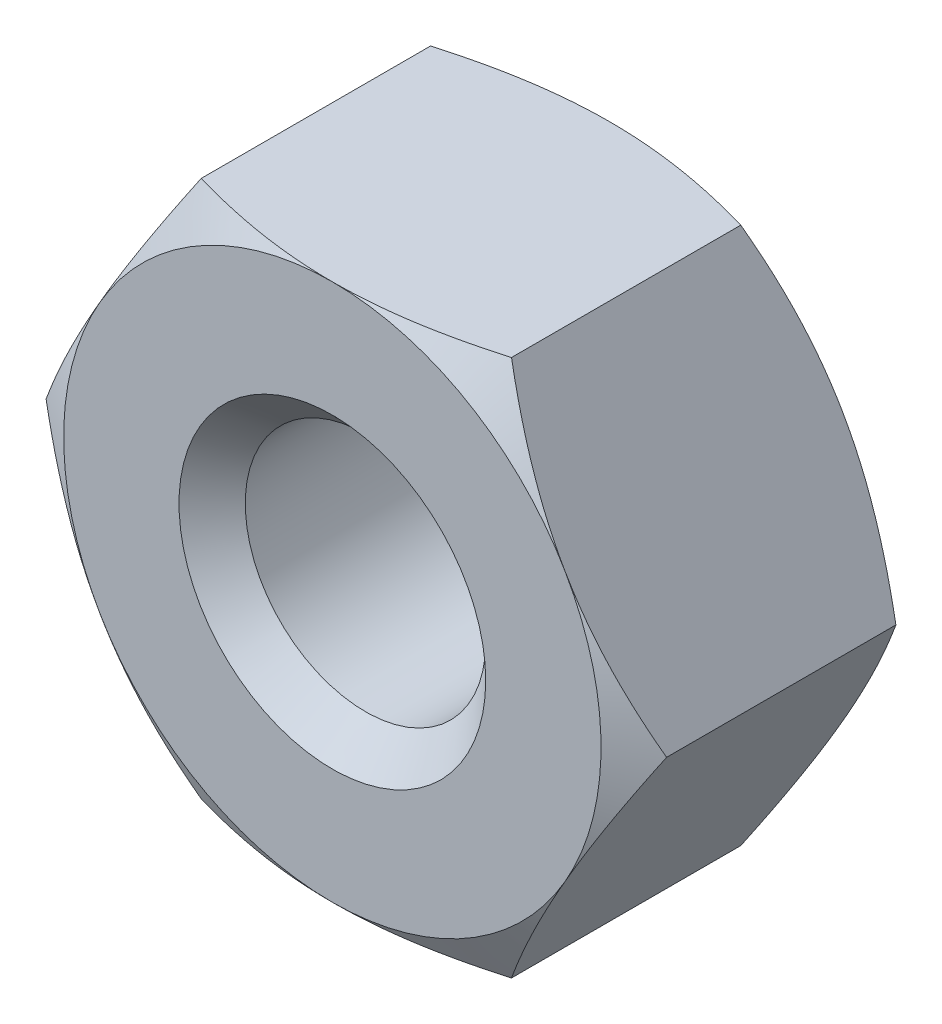
ISO-10303-21;
HEADER;
FILE_DESCRIPTION(('STEP AP214'),'2;1');
FILE_NAME('part.step','',(''),(''),'','','');
FILE_SCHEMA(('AUTOMOTIVE_DESIGN { 1 0 10303 214 1 1 1 1 }'));
ENDSEC;
DATA;
#1=APPLICATION_CONTEXT('core data for automotive mechanical design processes');
#2=APPLICATION_PROTOCOL_DEFINITION('international standard','automotive_design',2000,#1);
#3=PRODUCT_CONTEXT('',#1,'mechanical');
#4=PRODUCT('Part','Part','',(#3));
#5=PRODUCT_RELATED_PRODUCT_CATEGORY('part','',(#4));
#6=PRODUCT_DEFINITION_FORMATION('','',#4);
#7=PRODUCT_DEFINITION_CONTEXT('part definition',#1,'design');
#8=PRODUCT_DEFINITION('design','',#6,#7);
#9=PRODUCT_DEFINITION_SHAPE('','',#8);
#10=(LENGTH_UNIT() NAMED_UNIT(*) SI_UNIT(.MILLI.,.METRE.));
#11=(NAMED_UNIT(*) PLANE_ANGLE_UNIT() SI_UNIT($,.RADIAN.));
#12=(NAMED_UNIT(*) SI_UNIT($,.STERADIAN.) SOLID_ANGLE_UNIT());
#13=UNCERTAINTY_MEASURE_WITH_UNIT(LENGTH_MEASURE(1.E-05),#10,'distance_accuracy_value','');
#14=(GEOMETRIC_REPRESENTATION_CONTEXT(3) GLOBAL_UNCERTAINTY_ASSIGNED_CONTEXT((#13)) GLOBAL_UNIT_ASSIGNED_CONTEXT((#10,
#11,#12)) REPRESENTATION_CONTEXT('',''));
#15=CARTESIAN_POINT('',(0.,0.,0.));
#16=DIRECTION('',(0.,0.,1.));
#17=DIRECTION('',(1.,0.,0.));
#18=AXIS2_PLACEMENT_3D('',#15,#16,#17);
#19=CARTESIAN_POINT('',(0.,5.5626,2.8702));
#20=DIRECTION('',(0.,1.,0.));
#21=DIRECTION('',(0.,0.,1.));
#22=AXIS2_PLACEMENT_3D('',#19,#20,#21);
#23=PLANE('',#22);
#24=CARTESIAN_POINT('',(-8.51755323283637,5.5626,-0.208347349041716));
#25=CARTESIAN_POINT('',(-8.27332363806113,5.5626,-0.326372580376814));
#26=CARTESIAN_POINT('',(-8.02851660217952,5.5626,-0.443224542754662));
#27=CARTESIAN_POINT('',(-7.53743543039807,5.5626,-0.673911484447097));
#28=CARTESIAN_POINT('',(-7.29116104940888,5.5626,-0.787745941404617));
#29=CARTESIAN_POINT('',(-6.79550261529566,5.5626,-1.01232711326835));
#30=CARTESIAN_POINT('',(-6.54610883179355,5.5626,-1.1230524304109));
#31=CARTESIAN_POINT('',(-6.04527145316439,5.5626,-1.33974714026001));
#32=CARTESIAN_POINT('',(-5.79382796569385,5.5626,-1.44571678087108));
#33=CARTESIAN_POINT('',(-5.28536985938512,5.5626,-1.6528936222606));
#34=CARTESIAN_POINT('',(-5.02832474245623,5.5626,-1.75402638308214));
#35=CARTESIAN_POINT('',(-4.51120244313152,5.5626,-1.94837115353764));
#36=CARTESIAN_POINT('',(-4.25112492704733,5.5626,-2.04158228193144));
#37=CARTESIAN_POINT('',(-3.72805915600318,5.5626,-2.21757948920176));
#38=CARTESIAN_POINT('',(-3.46507843403137,5.5626,-2.30038773168016));
#39=CARTESIAN_POINT('',(-2.93537565240331,5.5626,-2.45288885972893));
#40=CARTESIAN_POINT('',(-2.66865480466814,5.5626,-2.52258589284272));
#41=CARTESIAN_POINT('',(-2.13130244368554,5.5626,-2.64548458392627));
#42=CARTESIAN_POINT('',(-1.86066990920863,5.5626,-2.69868184978898));
#43=CARTESIAN_POINT('',(-1.31610403640452,5.5626,-2.78498591226744));
#44=CARTESIAN_POINT('',(-1.04217069515921,5.5626,-2.81809269112068));
#45=CARTESIAN_POINT('',(-0.630834751400418,5.5626,-2.85056268521566));
#46=CARTESIAN_POINT('',(-0.494076025771256,5.5626,-2.85852263513214));
#47=CARTESIAN_POINT('',(-0.220337929367823,5.5626,-2.86864753142894));
#48=CARTESIAN_POINT('',(-0.0833585614820218,5.5626,-2.87081255306466));
#49=CARTESIAN_POINT('',(0.190527986234609,5.5626,-2.86928943521574));
#50=CARTESIAN_POINT('',(0.327435175535792,5.5626,-2.86560293840438));
#51=CARTESIAN_POINT('',(0.600975289543898,5.5626,-2.85247021161173));
#52=CARTESIAN_POINT('',(0.737608200212511,5.5626,-2.84302369399677));
#53=CARTESIAN_POINT('',(1.06876418963154,5.5626,-2.81334435018549));
#54=CARTESIAN_POINT('',(1.26303278569101,5.5626,-2.79022532002115));
#55=CARTESIAN_POINT('',(1.65008136813439,5.5626,-2.73362542907433));
#56=CARTESIAN_POINT('',(1.84286093346577,5.5626,-2.70014174004453));
#57=CARTESIAN_POINT('',(2.22677234634108,5.5626,-2.62400003398817));
#58=CARTESIAN_POINT('',(2.41790245700259,5.5626,-2.58133334257669));
#59=CARTESIAN_POINT('',(2.79819622482317,5.5626,-2.48812745826837));
#60=CARTESIAN_POINT('',(2.98736006544266,5.5626,-2.437589006999));
#61=CARTESIAN_POINT('',(3.36838035193452,5.5626,-2.32852760486082));
#62=CARTESIAN_POINT('',(3.56018914103518,5.5626,-2.26983930247945));
#63=CARTESIAN_POINT('',(3.94177929576716,5.5626,-2.14666395442924));
#64=CARTESIAN_POINT('',(4.13156196016662,5.5626,-2.08218090838606));
#65=CARTESIAN_POINT('',(4.50833833653704,5.5626,-1.94874803332032));
#66=CARTESIAN_POINT('',(4.69534173392172,5.5626,-1.87982538930164));
#67=CARTESIAN_POINT('',(5.06789764166536,5.5626,-1.73793473455086));
#68=CARTESIAN_POINT('',(5.2534495305557,5.5626,-1.66496508881955));
#69=CARTESIAN_POINT('',(5.43832732995836,5.5626,-1.59037228005264));
#70=B_SPLINE_CURVE_WITH_KNOTS('',3,(#24,#25,#26,#27,#28,#29,#30,#31,#32,#33,#34,#35,#36,#37,#38,
#39,#40,#41,#42,#43,#44,#45,#46,#47,#48,#49,#50,#51,#52,#53,#54,#55,#56,#57,#58,#59,#60,#61,#62,
#63,#64,#65,#66,#67,#68,#69),.UNSPECIFIED.,.F.,.F.,(4,2,2,2,2,2,2,2,2,2,2,2,2,2,2,2,2,2,2,2,2,2,
4),(0.,0.813769153285017,1.62767826928287,2.44624505844444,3.26476912757194,4.09334213197154,
4.92200719045545,5.74887568591705,6.57548217189049,7.40230850547898,8.22913557008481,
8.64000180756481,9.05086270933452,9.46160829216968,9.87237438776677,10.4589658361105,
11.0457174914015,11.633025851848,12.2202789132433,12.8219268163372,13.4231625958885,
14.021014216553,14.6191091556216),.UNSPECIFIED.);
#71=CARTESIAN_POINT('',(-3.21156860739421,5.5626,-2.37336860739422));
#72=VERTEX_POINT('',#71);
#73=CARTESIAN_POINT('',(0.,5.5626,-2.8702));
#74=VERTEX_POINT('',#73);
#75=EDGE_CURVE('E464',#72,#74,#70,.T.);
#76=ORIENTED_EDGE('',*,*,#75,.F.);
#77=DIRECTION('',(0.,0.,-1.));
#78=VECTOR('',#77,1.);
#79=CARTESIAN_POINT('',(-3.21156860739422,5.5626,2.8702));
#80=LINE('',#79,#78);
#81=CARTESIAN_POINT('',(-3.21156860739421,5.5626,2.37336860739422));
#82=VERTEX_POINT('',#81);
#83=EDGE_CURVE('E146',#82,#72,#80,.T.);
#84=ORIENTED_EDGE('',*,*,#83,.F.);
#85=CARTESIAN_POINT('',(-8.51755323283637,5.5626,0.208347349041714));
#86=CARTESIAN_POINT('',(-8.27332363806113,5.5626,0.326372580376813));
#87=CARTESIAN_POINT('',(-8.02851660217952,5.5626,0.443224542754661));
#88=CARTESIAN_POINT('',(-7.53743543039807,5.5626,0.673911484447096));
#89=CARTESIAN_POINT('',(-7.29116104940888,5.5626,0.787745941404615));
#90=CARTESIAN_POINT('',(-6.79550261529566,5.5626,1.01232711326835));
#91=CARTESIAN_POINT('',(-6.54610883179356,5.5626,1.1230524304109));
#92=CARTESIAN_POINT('',(-6.0452714531644,5.5626,1.33974714026001));
#93=CARTESIAN_POINT('',(-5.79382796569386,5.5626,1.44571678087108));
#94=CARTESIAN_POINT('',(-5.28536985938512,5.5626,1.6528936222606));
#95=CARTESIAN_POINT('',(-5.02832474245624,5.5626,1.75402638308214));
#96=CARTESIAN_POINT('',(-4.51120244313152,5.5626,1.94837115353763));
#97=CARTESIAN_POINT('',(-4.25112492704734,5.5626,2.04158228193144));
#98=CARTESIAN_POINT('',(-3.72805915600318,5.5626,2.21757948920176));
#99=CARTESIAN_POINT('',(-3.46507843403138,5.5626,2.30038773168015));
#100=CARTESIAN_POINT('',(-2.93537565240331,5.5626,2.45288885972893));
#101=CARTESIAN_POINT('',(-2.66865480466815,5.5626,2.52258589284272));
#102=CARTESIAN_POINT('',(-2.13130244368554,5.5626,2.64548458392627));
#103=CARTESIAN_POINT('',(-1.86066990920863,5.5626,2.69868184978897));
#104=CARTESIAN_POINT('',(-1.31610403640452,5.5626,2.78498591226744));
#105=CARTESIAN_POINT('',(-1.04217069515921,5.5626,2.81809269112068));
#106=CARTESIAN_POINT('',(-0.63083475140042,5.5626,2.85056268521566));
#107=CARTESIAN_POINT('',(-0.494076025771258,5.5626,2.85852263513214));
#108=CARTESIAN_POINT('',(-0.220337929367824,5.5626,2.86864753142893));
#109=CARTESIAN_POINT('',(-0.0833585614820228,5.5626,2.87081255306466));
#110=CARTESIAN_POINT('',(0.190527986234609,5.5626,2.86928943521574));
#111=CARTESIAN_POINT('',(0.327435175535791,5.5626,2.86560293840438));
#112=CARTESIAN_POINT('',(0.600975289543897,5.5626,2.85247021161173));
#113=CARTESIAN_POINT('',(0.73760820021251,5.5626,2.84302369399677));
#114=CARTESIAN_POINT('',(1.06876418963153,5.5626,2.81334435018549));
#115=CARTESIAN_POINT('',(1.263032785691,5.5626,2.79022532002115));
#116=CARTESIAN_POINT('',(1.65008136813439,5.5626,2.73362542907433));
#117=CARTESIAN_POINT('',(1.84286093346577,5.5626,2.70014174004453));
#118=CARTESIAN_POINT('',(2.22677234634107,5.5626,2.62400003398817));
#119=CARTESIAN_POINT('',(2.41790245700259,5.5626,2.58133334257669));
#120=CARTESIAN_POINT('',(2.79819622482316,5.5626,2.48812745826837));
#121=CARTESIAN_POINT('',(2.98736006544265,5.5626,2.43758900699901));
#122=CARTESIAN_POINT('',(3.36838035193452,5.5626,2.32852760486083));
#123=CARTESIAN_POINT('',(3.56018914103517,5.5626,2.26983930247945));
#124=CARTESIAN_POINT('',(3.94177929576715,5.5626,2.14666395442924));
#125=CARTESIAN_POINT('',(4.13156196016661,5.5626,2.08218090838606));
#126=CARTESIAN_POINT('',(4.50833833653703,5.5626,1.94874803332033));
#127=CARTESIAN_POINT('',(4.69534173392171,5.5626,1.87982538930164));
#128=CARTESIAN_POINT('',(5.06789764166535,5.5626,1.73793473455086));
#129=CARTESIAN_POINT('',(5.25344953055569,5.5626,1.66496508881956));
#130=CARTESIAN_POINT('',(5.43832732995835,5.5626,1.59037228005265));
#131=B_SPLINE_CURVE_WITH_KNOTS('',3,(#85,#86,#87,#88,#89,#90,#91,#92,#93,#94,#95,#96,#97,#98,
#99,#100,#101,#102,#103,#104,#105,#106,#107,#108,#109,#110,#111,#112,#113,#114,#115,#116,#117,
#118,#119,#120,#121,#122,#123,#124,#125,#126,#127,#128,#129,#130),.UNSPECIFIED.,.F.,.F.,(4,2,2,
2,2,2,2,2,2,2,2,2,2,2,2,2,2,2,2,2,2,2,4),(0.,0.813769153285015,1.62767826928287,
2.44624505844444,3.26476912757194,4.09334213197154,4.92200719045544,5.74887568591705,
6.57548217189049,7.40230850547898,8.22913557008481,8.64000180756481,9.05086270933452,
9.46160829216968,9.87237438776677,10.4589658361105,11.0457174914015,11.633025851848,
12.2202789132433,12.8219268163372,13.4231625958885,14.021014216553,14.6191091556215),.UNSPECIFIED.);
#132=CARTESIAN_POINT('',(0.,5.5626,2.8702));
#133=VERTEX_POINT('',#132);
#134=EDGE_CURVE('E277',#82,#133,#131,.T.);
#135=ORIENTED_EDGE('',*,*,#134,.T.);
#136=CARTESIAN_POINT('',(3.21156860739421,5.5626,2.37336860739422));
#137=VERTEX_POINT('',#136);
#138=EDGE_CURVE('E194',#133,#137,#131,.T.);
#139=ORIENTED_EDGE('',*,*,#138,.T.);
#140=DIRECTION('',(0.,0.,-1.));
#141=VECTOR('',#140,1.);
#142=CARTESIAN_POINT('',(3.21156860739421,5.5626,2.8702));
#143=LINE('',#142,#141);
#144=CARTESIAN_POINT('',(3.21156860739421,5.5626,-2.37336860739422));
#145=VERTEX_POINT('',#144);
#146=EDGE_CURVE('E132',#137,#145,#143,.T.);
#147=ORIENTED_EDGE('',*,*,#146,.T.);
#148=EDGE_CURVE('E125',#74,#145,#70,.T.);
#149=ORIENTED_EDGE('',*,*,#148,.F.);
#150=EDGE_LOOP('',(#76,#84,#135,#139,#147,#149));
#151=FACE_BOUND('',#150,.T.);
#152=ADVANCED_FACE('F17',(#151),#23,.T.);
#153=CARTESIAN_POINT('',(-4.81735291109132,2.7813,2.8702));
#154=DIRECTION('',(-0.866025403784439,0.5,0.));
#155=DIRECTION('',(-0.5,-0.866025403784439,0.));
#156=AXIS2_PLACEMENT_3D('',#153,#154,#155);
#157=PLANE('',#156);
#158=CARTESIAN_POINT('',(-6.42325268484226,-0.00020000000000477,-2.37330193892986));
#159=CARTESIAN_POINT('',(-6.35265858120791,0.122072574209488,-2.41405379774487));
#160=CARTESIAN_POINT('',(-6.28180126837449,0.244801040124761,-2.45295622469128));
#161=CARTESIAN_POINT('',(-6.13951120287093,0.491254662989242,-2.52655283843946));
#162=CARTESIAN_POINT('',(-6.06807821602765,0.614980225538196,-2.56124520986096));
#163=CARTESIAN_POINT('',(-5.85263550648139,0.988137944592619,-2.65832629893315));
#164=CARTESIAN_POINT('',(-5.70777535201369,1.23904309212296,-2.71354515807663));
#165=CARTESIAN_POINT('',(-5.49099476252075,1.61451808721945,-2.77829621381847));
#166=CARTESIAN_POINT('',(-5.41972205873199,1.73796603137439,-2.79674200165707));
#167=CARTESIAN_POINT('',(-5.27685459691414,1.98541973399132,-2.82767310833254));
#168=CARTESIAN_POINT('',(-5.20525986790488,2.10942544218948,-2.84015895381099));
#169=CARTESIAN_POINT('',(-5.06194605565757,2.35765224642821,-2.85885197006053));
#170=CARTESIAN_POINT('',(-4.9902272065059,2.48187293701927,-2.86506626659415));
#171=CARTESIAN_POINT('',(-4.84672720555795,2.7304222295473,-2.8710895993591));
#172=CARTESIAN_POINT('',(-4.7749460557547,2.85475082803225,-2.8708988334483));
#173=CARTESIAN_POINT('',(-4.57828637012705,3.19537539533984,-2.86157189863658));
#174=CARTESIAN_POINT('',(-4.4534722013835,3.41155987710816,-2.84591260446492));
#175=CARTESIAN_POINT('',(-4.20467287416474,3.84249295274001,-2.79625567661839));
#176=CARTESIAN_POINT('',(-4.08068859075412,4.05724003094723,-2.76224106857654));
#177=CARTESIAN_POINT('',(-3.83138850679899,4.4890404426887,-2.67721395859032));
#178=CARTESIAN_POINT('',(-3.70610416511177,4.70603928788379,-2.6258411860626));
#179=CARTESIAN_POINT('',(-3.45740388365366,5.13680081122591,-2.5092455430004));
#180=CARTESIAN_POINT('',(-3.33398475856357,5.35056900650764,-2.44405006238294));
#181=CARTESIAN_POINT('',(-3.21145313734037,5.5628,-2.37330193892986));
#182=B_SPLINE_CURVE_WITH_KNOTS('',3,(#158,#159,#160,#161,#162,#163,#164,#165,#166,#167,#168,
#169,#170,#171,#172,#173,#174,#175,#176,#177,#178,#179,#180,#181),.UNSPECIFIED.,.F.,.F.,(4,2,2,
2,2,2,2,2,2,2,2,4),(0.,0.44082011856227,0.881829648847399,1.76568130465016,2.19678242164486,
2.62784543796583,3.05841812523868,3.48897751176352,4.23854798324166,4.98881282275669,
5.75571809391027,6.52111769989992),.UNSPECIFIED.);
#183=CARTESIAN_POINT('',(-6.42313721478843,0.,-2.37336860739422));
#184=VERTEX_POINT('',#183);
#185=CARTESIAN_POINT('',(-4.81735291109132,2.7813,-2.8702));
#186=VERTEX_POINT('',#185);
#187=EDGE_CURVE('E238',#184,#186,#182,.T.);
#188=ORIENTED_EDGE('',*,*,#187,.F.);
#189=DIRECTION('',(0.,0.,-1.));
#190=VECTOR('',#189,1.);
#191=CARTESIAN_POINT('',(-6.42313721478842,0.,2.8702));
#192=LINE('',#191,#190);
#193=CARTESIAN_POINT('',(-6.42313721478843,0.,2.37336860739422));
#194=VERTEX_POINT('',#193);
#195=EDGE_CURVE('E143',#194,#184,#192,.T.);
#196=ORIENTED_EDGE('',*,*,#195,.F.);
#197=CARTESIAN_POINT('',(-6.42325268484226,-0.00020000000000477,2.37330193892986));
#198=CARTESIAN_POINT('',(-6.35265858120791,0.122072574209488,2.41405379774487));
#199=CARTESIAN_POINT('',(-6.28180126837449,0.244801040124761,2.45295622469128));
#200=CARTESIAN_POINT('',(-6.13951120287093,0.491254662989242,2.52655283843946));
#201=CARTESIAN_POINT('',(-6.06807821602765,0.614980225538196,2.56124520986096));
#202=CARTESIAN_POINT('',(-5.85263550648139,0.988137944592619,2.65832629893315));
#203=CARTESIAN_POINT('',(-5.70777535201369,1.23904309212296,2.71354515807663));
#204=CARTESIAN_POINT('',(-5.49099476252075,1.61451808721945,2.77829621381847));
#205=CARTESIAN_POINT('',(-5.41972205873199,1.73796603137439,2.79674200165707));
#206=CARTESIAN_POINT('',(-5.27685459691414,1.98541973399132,2.82767310833254));
#207=CARTESIAN_POINT('',(-5.20525986790488,2.10942544218948,2.84015895381099));
#208=CARTESIAN_POINT('',(-5.06194605565757,2.35765224642821,2.85885197006053));
#209=CARTESIAN_POINT('',(-4.9902272065059,2.48187293701927,2.86506626659415));
#210=CARTESIAN_POINT('',(-4.84672720555795,2.7304222295473,2.8710895993591));
#211=CARTESIAN_POINT('',(-4.7749460557547,2.85475082803225,2.8708988334483));
#212=CARTESIAN_POINT('',(-4.57828637012705,3.19537539533984,2.86157189863658));
#213=CARTESIAN_POINT('',(-4.4534722013835,3.41155987710816,2.84591260446492));
#214=CARTESIAN_POINT('',(-4.20467287416474,3.84249295274001,2.79625567661839));
#215=CARTESIAN_POINT('',(-4.08068859075412,4.05724003094723,2.76224106857654));
#216=CARTESIAN_POINT('',(-3.83138850679899,4.4890404426887,2.67721395859032));
#217=CARTESIAN_POINT('',(-3.70610416511177,4.70603928788379,2.6258411860626));
#218=CARTESIAN_POINT('',(-3.45740388365366,5.13680081122591,2.5092455430004));
#219=CARTESIAN_POINT('',(-3.33398475856357,5.35056900650764,2.44405006238294));
#220=CARTESIAN_POINT('',(-3.21145313734037,5.5628,2.37330193892986));
#221=B_SPLINE_CURVE_WITH_KNOTS('',3,(#197,#198,#199,#200,#201,#202,#203,#204,#205,#206,#207,
#208,#209,#210,#211,#212,#213,#214,#215,#216,#217,#218,#219,#220),.UNSPECIFIED.,.F.,.F.,(4,2,2,
2,2,2,2,2,2,2,2,4),(0.,0.44082011856227,0.881829648847399,1.76568130465016,2.19678242164486,
2.62784543796583,3.05841812523868,3.48897751176352,4.23854798324166,4.98881282275669,
5.75571809391027,6.52111769989992),.UNSPECIFIED.);
#222=CARTESIAN_POINT('',(-4.81735291109132,2.7813,2.8702));
#223=VERTEX_POINT('',#222);
#224=EDGE_CURVE('E215',#194,#223,#221,.T.);
#225=ORIENTED_EDGE('',*,*,#224,.T.);
#226=EDGE_CURVE('E208',#223,#82,#221,.T.);
#227=ORIENTED_EDGE('',*,*,#226,.T.);
#228=ORIENTED_EDGE('',*,*,#83,.T.);
#229=EDGE_CURVE('E231',#186,#72,#182,.T.);
#230=ORIENTED_EDGE('',*,*,#229,.F.);
#231=EDGE_LOOP('',(#188,#196,#225,#227,#228,#230));
#232=FACE_BOUND('',#231,.T.);
#233=ADVANCED_FACE('F222',(#232),#157,.T.);
#234=CARTESIAN_POINT('',(-4.81735291109132,-2.7813,2.8702));
#235=DIRECTION('',(-0.866025403784438,-0.5,0.));
#236=DIRECTION('',(0.5,-0.866025403784438,0.));
#237=AXIS2_PLACEMENT_3D('',#234,#235,#236);
#238=PLANE('',#237);
#239=CARTESIAN_POINT('',(-3.21145313734037,-5.5628,-2.37330193892986));
#240=CARTESIAN_POINT('',(-3.28204724097473,-5.44052742579051,-2.41405379774487));
#241=CARTESIAN_POINT('',(-3.35290455380814,-5.31779895987524,-2.45295622469128));
#242=CARTESIAN_POINT('',(-3.49519461931171,-5.07134533701076,-2.52655283843946));
#243=CARTESIAN_POINT('',(-3.56662760615499,-4.9476197744618,-2.56124520986096));
#244=CARTESIAN_POINT('',(-3.78207031570124,-4.57446205540738,-2.65832629893315));
#245=CARTESIAN_POINT('',(-3.92693047016895,-4.32355690787704,-2.71354515807663));
#246=CARTESIAN_POINT('',(-4.14371105966188,-3.94808191278055,-2.77829621381847));
#247=CARTESIAN_POINT('',(-4.21498376345065,-3.82463396862561,-2.79674200165707));
#248=CARTESIAN_POINT('',(-4.3578512252685,-3.57718026600868,-2.82767310833254));
#249=CARTESIAN_POINT('',(-4.42944595427775,-3.45317455781052,-2.84015895381099));
#250=CARTESIAN_POINT('',(-4.57275976652507,-3.20494775357179,-2.85885197006053));
#251=CARTESIAN_POINT('',(-4.64447861567674,-3.08072706298073,-2.86506626659415));
#252=CARTESIAN_POINT('',(-4.78797861662469,-2.8321777704527,-2.87108959935909));
#253=CARTESIAN_POINT('',(-4.85975976642794,-2.70784917196775,-2.87089883344829));
#254=CARTESIAN_POINT('',(-5.05641945205558,-2.36722460466016,-2.86157189863657));
#255=CARTESIAN_POINT('',(-5.18123362079914,-2.15104012289184,-2.84591260446492));
#256=CARTESIAN_POINT('',(-5.4300329480179,-1.72010704725999,-2.79625567661839));
#257=CARTESIAN_POINT('',(-5.55401723142852,-1.50535996905278,-2.76224106857654));
#258=CARTESIAN_POINT('',(-5.80331731538365,-1.07355955731131,-2.67721395859032));
#259=CARTESIAN_POINT('',(-5.92860165707087,-0.856560712116218,-2.6258411860626));
#260=CARTESIAN_POINT('',(-6.17730193852898,-0.42579918877409,-2.5092455430004));
#261=CARTESIAN_POINT('',(-6.30072106361906,-0.212030993492369,-2.44405006238294));
#262=CARTESIAN_POINT('',(-6.42325268484226,0.000199999999994657,-2.37330193892986));
#263=B_SPLINE_CURVE_WITH_KNOTS('',3,(#239,#240,#241,#242,#243,#244,#245,#246,#247,#248,#249,
#250,#251,#252,#253,#254,#255,#256,#257,#258,#259,#260,#261,#262),.UNSPECIFIED.,.F.,.F.,(4,2,2,
2,2,2,2,2,2,2,2,4),(0.,0.440820118562271,0.881829648847399,1.76568130465016,2.19678242164486,
2.62784543796583,3.05841812523868,3.48897751176353,4.23854798324166,4.98881282275669,
5.75571809391027,6.52111769989991),.UNSPECIFIED.);
#264=CARTESIAN_POINT('',(-3.21156860739421,-5.5626,-2.37336860739422));
#265=VERTEX_POINT('',#264);
#266=CARTESIAN_POINT('',(-4.81735291109132,-2.7813,-2.8702));
#267=VERTEX_POINT('',#266);
#268=EDGE_CURVE('E250',#265,#267,#263,.T.);
#269=ORIENTED_EDGE('',*,*,#268,.F.);
#270=DIRECTION('',(0.,0.,-1.));
#271=VECTOR('',#270,1.);
#272=CARTESIAN_POINT('',(-3.21156860739421,-5.5626,2.8702));
#273=LINE('',#272,#271);
#274=CARTESIAN_POINT('',(-3.21156860739421,-5.5626,2.37336860739422));
#275=VERTEX_POINT('',#274);
#276=EDGE_CURVE('E134',#275,#265,#273,.T.);
#277=ORIENTED_EDGE('',*,*,#276,.F.);
#278=CARTESIAN_POINT('',(-3.21145313734037,-5.5628,2.37330193892986));
#279=CARTESIAN_POINT('',(-3.28204724097473,-5.44052742579051,2.41405379774487));
#280=CARTESIAN_POINT('',(-3.35290455380814,-5.31779895987524,2.45295622469128));
#281=CARTESIAN_POINT('',(-3.49519461931171,-5.07134533701076,2.52655283843946));
#282=CARTESIAN_POINT('',(-3.56662760615499,-4.9476197744618,2.56124520986096));
#283=CARTESIAN_POINT('',(-3.78207031570124,-4.57446205540738,2.65832629893315));
#284=CARTESIAN_POINT('',(-3.92693047016895,-4.32355690787704,2.71354515807663));
#285=CARTESIAN_POINT('',(-4.14371105966188,-3.94808191278055,2.77829621381847));
#286=CARTESIAN_POINT('',(-4.21498376345065,-3.82463396862561,2.79674200165707));
#287=CARTESIAN_POINT('',(-4.3578512252685,-3.57718026600868,2.82767310833254));
#288=CARTESIAN_POINT('',(-4.42944595427775,-3.45317455781052,2.84015895381099));
#289=CARTESIAN_POINT('',(-4.57275976652507,-3.20494775357179,2.85885197006053));
#290=CARTESIAN_POINT('',(-4.64447861567674,-3.08072706298073,2.86506626659415));
#291=CARTESIAN_POINT('',(-4.78797861662469,-2.8321777704527,2.8710895993591));
#292=CARTESIAN_POINT('',(-4.85975976642794,-2.70784917196775,2.8708988334483));
#293=CARTESIAN_POINT('',(-5.05641945205558,-2.36722460466016,2.86157189863658));
#294=CARTESIAN_POINT('',(-5.18123362079914,-2.15104012289184,2.84591260446492));
#295=CARTESIAN_POINT('',(-5.4300329480179,-1.72010704725999,2.79625567661839));
#296=CARTESIAN_POINT('',(-5.55401723142852,-1.50535996905278,2.76224106857654));
#297=CARTESIAN_POINT('',(-5.80331731538365,-1.07355955731131,2.67721395859032));
#298=CARTESIAN_POINT('',(-5.92860165707087,-0.856560712116218,2.6258411860626));
#299=CARTESIAN_POINT('',(-6.17730193852898,-0.42579918877409,2.5092455430004));
#300=CARTESIAN_POINT('',(-6.30072106361906,-0.212030993492369,2.44405006238294));
#301=CARTESIAN_POINT('',(-6.42325268484226,0.000199999999994931,2.37330193892986));
#302=B_SPLINE_CURVE_WITH_KNOTS('',3,(#278,#279,#280,#281,#282,#283,#284,#285,#286,#287,#288,
#289,#290,#291,#292,#293,#294,#295,#296,#297,#298,#299,#300,#301),.UNSPECIFIED.,.F.,.F.,(4,2,2,
2,2,2,2,2,2,2,2,4),(0.,0.44082011856227,0.881829648847399,1.76568130465016,2.19678242164486,
2.62784543796583,3.05841812523868,3.48897751176353,4.23854798324166,4.98881282275669,
5.75571809391027,6.52111769989992),.UNSPECIFIED.);
#303=CARTESIAN_POINT('',(-4.81735291109132,-2.7813,2.8702));
#304=VERTEX_POINT('',#303);
#305=EDGE_CURVE('E137',#275,#304,#302,.T.);
#306=ORIENTED_EDGE('',*,*,#305,.T.);
#307=EDGE_CURVE('E216',#304,#194,#302,.T.);
#308=ORIENTED_EDGE('',*,*,#307,.T.);
#309=ORIENTED_EDGE('',*,*,#195,.T.);
#310=EDGE_CURVE('E245',#267,#184,#263,.T.);
#311=ORIENTED_EDGE('',*,*,#310,.F.);
#312=EDGE_LOOP('',(#269,#277,#306,#308,#309,#311));
#313=FACE_BOUND('',#312,.T.);
#314=ADVANCED_FACE('F225',(#313),#238,.T.);
#315=CARTESIAN_POINT('',(0.,-5.5626,2.8702));
#316=DIRECTION('',(0.,-1.,0.));
#317=DIRECTION('',(1.,0.,0.));
#318=AXIS2_PLACEMENT_3D('',#315,#316,#317);
#319=PLANE('',#318);
#320=CARTESIAN_POINT('',(-8.51755323283636,-5.5626,-0.208347349041715));
#321=CARTESIAN_POINT('',(-8.27332363806112,-5.5626,-0.326372580376817));
#322=CARTESIAN_POINT('',(-8.02851660217951,-5.5626,-0.443224542754665));
#323=CARTESIAN_POINT('',(-7.53743543039807,-5.5626,-0.673911484447099));
#324=CARTESIAN_POINT('',(-7.29116104940887,-5.5626,-0.787745941404618));
#325=CARTESIAN_POINT('',(-6.79550261529565,-5.5626,-1.01232711326835));
#326=CARTESIAN_POINT('',(-6.54610883179355,-5.5626,-1.1230524304109));
#327=CARTESIAN_POINT('',(-6.04527145316439,-5.5626,-1.33974714026002));
#328=CARTESIAN_POINT('',(-5.79382796569385,-5.5626,-1.44571678087108));
#329=CARTESIAN_POINT('',(-5.28536985938511,-5.5626,-1.6528936222606));
#330=CARTESIAN_POINT('',(-5.02832474245623,-5.5626,-1.75402638308214));
#331=CARTESIAN_POINT('',(-4.51120244313152,-5.5626,-1.94837115353764));
#332=CARTESIAN_POINT('',(-4.25112492704733,-5.5626,-2.04158228193144));
#333=CARTESIAN_POINT('',(-3.72805915600318,-5.5626,-2.21757948920176));
#334=CARTESIAN_POINT('',(-3.46507843403137,-5.5626,-2.30038773168015));
#335=CARTESIAN_POINT('',(-2.93537565240331,-5.5626,-2.45288885972893));
#336=CARTESIAN_POINT('',(-2.66865480466814,-5.5626,-2.52258589284272));
#337=CARTESIAN_POINT('',(-2.13130244368553,-5.5626,-2.64548458392627));
#338=CARTESIAN_POINT('',(-1.86066990920863,-5.5626,-2.69868184978898));
#339=CARTESIAN_POINT('',(-1.31610403640452,-5.5626,-2.78498591226744));
#340=CARTESIAN_POINT('',(-1.0421706951592,-5.5626,-2.81809269112068));
#341=CARTESIAN_POINT('',(-0.630834751400415,-5.5626,-2.85056268521566));
#342=CARTESIAN_POINT('',(-0.494076025771253,-5.5626,-2.85852263513214));
#343=CARTESIAN_POINT('',(-0.220337929367819,-5.5626,-2.86864753142893));
#344=CARTESIAN_POINT('',(-0.0833585614820178,-5.5626,-2.87081255306466));
#345=CARTESIAN_POINT('',(0.190527986234613,-5.5626,-2.86928943521574));
#346=CARTESIAN_POINT('',(0.327435175535796,-5.5626,-2.86560293840438));
#347=CARTESIAN_POINT('',(0.600975289543902,-5.5626,-2.85247021161172));
#348=CARTESIAN_POINT('',(0.737608200212515,-5.5626,-2.84302369399677));
#349=CARTESIAN_POINT('',(1.06876418963154,-5.5626,-2.81334435018548));
#350=CARTESIAN_POINT('',(1.26303278569101,-5.5626,-2.79022532002115));
#351=CARTESIAN_POINT('',(1.6500813681344,-5.5626,-2.73362542907433));
#352=CARTESIAN_POINT('',(1.84286093346578,-5.5626,-2.70014174004453));
#353=CARTESIAN_POINT('',(2.22677234634108,-5.5626,-2.62400003398817));
#354=CARTESIAN_POINT('',(2.4179024570026,-5.5626,-2.58133334257669));
#355=CARTESIAN_POINT('',(2.79819622482317,-5.5626,-2.48812745826837));
#356=CARTESIAN_POINT('',(2.98736006544266,-5.5626,-2.437589006999));
#357=CARTESIAN_POINT('',(3.36838035193453,-5.5626,-2.32852760486082));
#358=CARTESIAN_POINT('',(3.56018914103518,-5.5626,-2.26983930247945));
#359=CARTESIAN_POINT('',(3.94177929576716,-5.5626,-2.14666395442924));
#360=CARTESIAN_POINT('',(4.13156196016662,-5.5626,-2.08218090838606));
#361=CARTESIAN_POINT('',(4.50833833653704,-5.5626,-1.94874803332033));
#362=CARTESIAN_POINT('',(4.69534173392172,-5.5626,-1.87982538930164));
#363=CARTESIAN_POINT('',(5.06789764166536,-5.5626,-1.73793473455086));
#364=CARTESIAN_POINT('',(5.2534495305557,-5.5626,-1.66496508881956));
#365=CARTESIAN_POINT('',(5.43832732995836,-5.5626,-1.59037228005264));
#366=B_SPLINE_CURVE_WITH_KNOTS('',3,(#320,#321,#322,#323,#324,#325,#326,#327,#328,#329,#330,
#331,#332,#333,#334,#335,#336,#337,#338,#339,#340,#341,#342,#343,#344,#345,#346,#347,#348,#349,
#350,#351,#352,#353,#354,#355,#356,#357,#358,#359,#360,#361,#362,#363,#364,#365),.UNSPECIFIED.,
.F.,.F.,(4,2,2,2,2,2,2,2,2,2,2,2,2,2,2,2,2,2,2,2,2,2,4),(0.,0.813769153285015,1.62767826928287,
2.44624505844444,3.26476912757194,4.09334213197153,4.92200719045544,5.74887568591705,
6.57548217189048,7.40230850547898,8.22913557008481,8.64000180756481,9.05086270933452,
9.46160829216968,9.87237438776676,10.4589658361105,11.0457174914015,11.633025851848,
12.2202789132433,12.8219268163372,13.4231625958885,14.021014216553,14.6191091556215),.UNSPECIFIED.);
#367=CARTESIAN_POINT('',(3.21156860739422,-5.5626,-2.37336860739422));
#368=VERTEX_POINT('',#367);
#369=CARTESIAN_POINT('',(0.,-5.5626,-2.8702));
#370=VERTEX_POINT('',#369);
#371=EDGE_CURVE('E239',#368,#370,#366,.F.);
#372=ORIENTED_EDGE('',*,*,#371,.F.);
#373=DIRECTION('',(0.,0.,-1.));
#374=VECTOR('',#373,1.);
#375=CARTESIAN_POINT('',(3.21156860739422,-5.5626,2.8702));
#376=LINE('',#375,#374);
#377=CARTESIAN_POINT('',(3.21156860739422,-5.5626,2.37336860739422));
#378=VERTEX_POINT('',#377);
#379=EDGE_CURVE('E131',#378,#368,#376,.T.);
#380=ORIENTED_EDGE('',*,*,#379,.F.);
#381=CARTESIAN_POINT('',(-8.51755323283636,-5.5626,0.208347349041714));
#382=CARTESIAN_POINT('',(-8.27332363806112,-5.5626,0.326372580376817));
#383=CARTESIAN_POINT('',(-8.02851660217951,-5.5626,0.443224542754665));
#384=CARTESIAN_POINT('',(-7.53743543039807,-5.5626,0.673911484447099));
#385=CARTESIAN_POINT('',(-7.29116104940887,-5.5626,0.787745941404617));
#386=CARTESIAN_POINT('',(-6.79550261529565,-5.5626,1.01232711326835));
#387=CARTESIAN_POINT('',(-6.54610883179355,-5.5626,1.1230524304109));
#388=CARTESIAN_POINT('',(-6.04527145316439,-5.5626,1.33974714026002));
#389=CARTESIAN_POINT('',(-5.79382796569385,-5.5626,1.44571678087108));
#390=CARTESIAN_POINT('',(-5.28536985938511,-5.5626,1.6528936222606));
#391=CARTESIAN_POINT('',(-5.02832474245623,-5.5626,1.75402638308214));
#392=CARTESIAN_POINT('',(-4.51120244313152,-5.5626,1.94837115353764));
#393=CARTESIAN_POINT('',(-4.25112492704733,-5.5626,2.04158228193144));
#394=CARTESIAN_POINT('',(-3.72805915600318,-5.5626,2.21757948920176));
#395=CARTESIAN_POINT('',(-3.46507843403137,-5.5626,2.30038773168015));
#396=CARTESIAN_POINT('',(-2.93537565240331,-5.5626,2.45288885972893));
#397=CARTESIAN_POINT('',(-2.66865480466814,-5.5626,2.52258589284272));
#398=CARTESIAN_POINT('',(-2.13130244368553,-5.5626,2.64548458392627));
#399=CARTESIAN_POINT('',(-1.86066990920863,-5.5626,2.69868184978898));
#400=CARTESIAN_POINT('',(-1.31610403640452,-5.5626,2.78498591226744));
#401=CARTESIAN_POINT('',(-1.0421706951592,-5.5626,2.81809269112068));
#402=CARTESIAN_POINT('',(-0.630834751400415,-5.5626,2.85056268521566));
#403=CARTESIAN_POINT('',(-0.494076025771253,-5.5626,2.85852263513214));
#404=CARTESIAN_POINT('',(-0.220337929367819,-5.5626,2.86864753142893));
#405=CARTESIAN_POINT('',(-0.0833585614820178,-5.5626,2.87081255306466));
#406=CARTESIAN_POINT('',(0.190527986234613,-5.5626,2.86928943521574));
#407=CARTESIAN_POINT('',(0.327435175535796,-5.5626,2.86560293840438));
#408=CARTESIAN_POINT('',(0.600975289543902,-5.5626,2.85247021161172));
#409=CARTESIAN_POINT('',(0.737608200212515,-5.5626,2.84302369399677));
#410=CARTESIAN_POINT('',(1.06876418963154,-5.5626,2.81334435018548));
#411=CARTESIAN_POINT('',(1.26303278569101,-5.5626,2.79022532002115));
#412=CARTESIAN_POINT('',(1.6500813681344,-5.5626,2.73362542907433));
#413=CARTESIAN_POINT('',(1.84286093346578,-5.5626,2.70014174004453));
#414=CARTESIAN_POINT('',(2.22677234634108,-5.5626,2.62400003398817));
#415=CARTESIAN_POINT('',(2.4179024570026,-5.5626,2.58133334257669));
#416=CARTESIAN_POINT('',(2.79819622482318,-5.5626,2.48812745826837));
#417=CARTESIAN_POINT('',(2.98736006544266,-5.5626,2.437589006999));
#418=CARTESIAN_POINT('',(3.36838035193453,-5.5626,2.32852760486082));
#419=CARTESIAN_POINT('',(3.56018914103518,-5.5626,2.26983930247945));
#420=CARTESIAN_POINT('',(3.94177929576716,-5.5626,2.14666395442924));
#421=CARTESIAN_POINT('',(4.13156196016662,-5.5626,2.08218090838606));
#422=CARTESIAN_POINT('',(4.50833833653704,-5.5626,1.94874803332033));
#423=CARTESIAN_POINT('',(4.69534173392172,-5.5626,1.87982538930164));
#424=CARTESIAN_POINT('',(5.06789764166536,-5.5626,1.73793473455086));
#425=CARTESIAN_POINT('',(5.2534495305557,-5.5626,1.66496508881956));
#426=CARTESIAN_POINT('',(5.43832732995836,-5.5626,1.59037228005264));
#427=B_SPLINE_CURVE_WITH_KNOTS('',3,(#381,#382,#383,#384,#385,#386,#387,#388,#389,#390,#391,
#392,#393,#394,#395,#396,#397,#398,#399,#400,#401,#402,#403,#404,#405,#406,#407,#408,#409,#410,
#411,#412,#413,#414,#415,#416,#417,#418,#419,#420,#421,#422,#423,#424,#425,#426),.UNSPECIFIED.,
.F.,.F.,(4,2,2,2,2,2,2,2,2,2,2,2,2,2,2,2,2,2,2,2,2,2,4),(0.,0.813769153285016,1.62767826928287,
2.44624505844444,3.26476912757194,4.09334213197153,4.92200719045544,5.74887568591705,
6.57548217189048,7.40230850547898,8.22913557008481,8.64000180756481,9.05086270933452,
9.46160829216968,9.87237438776676,10.4589658361105,11.0457174914015,11.633025851848,
12.2202789132433,12.8219268163372,13.4231625958885,14.021014216553,14.6191091556215),.UNSPECIFIED.);
#428=CARTESIAN_POINT('',(0.,-5.5626,2.8702));
#429=VERTEX_POINT('',#428);
#430=EDGE_CURVE('E201',#378,#429,#427,.F.);
#431=ORIENTED_EDGE('',*,*,#430,.T.);
#432=EDGE_CURVE('E281',#429,#275,#427,.F.);
#433=ORIENTED_EDGE('',*,*,#432,.T.);
#434=ORIENTED_EDGE('',*,*,#276,.T.);
#435=EDGE_CURVE('E251',#370,#265,#366,.F.);
#436=ORIENTED_EDGE('',*,*,#435,.F.);
#437=EDGE_LOOP('',(#372,#380,#431,#433,#434,#436));
#438=FACE_BOUND('',#437,.T.);
#439=ADVANCED_FACE('F318',(#438),#319,.T.);
#440=CARTESIAN_POINT('',(4.81735291109132,-2.7813,2.8702));
#441=DIRECTION('',(0.866025403784439,-0.5,0.));
#442=DIRECTION('',(0.5,0.866025403784439,0.));
#443=AXIS2_PLACEMENT_3D('',#440,#441,#442);
#444=PLANE('',#443);
#445=CARTESIAN_POINT('',(6.42325268484226,0.000200000000001301,-2.37330193892986));
#446=CARTESIAN_POINT('',(6.3526585812079,-0.122072574209491,-2.41405379774487));
#447=CARTESIAN_POINT('',(6.28180126837449,-0.244801040124763,-2.45295622469128));
#448=CARTESIAN_POINT('',(6.13951120287093,-0.491254662989245,-2.52655283843946));
#449=CARTESIAN_POINT('',(6.06807821602765,-0.614980225538199,-2.56124520986096));
#450=CARTESIAN_POINT('',(5.85263550648139,-0.988137944592621,-2.65832629893315));
#451=CARTESIAN_POINT('',(5.70777535201369,-1.23904309212296,-2.71354515807663));
#452=CARTESIAN_POINT('',(5.49099476252075,-1.61451808721946,-2.77829621381847));
#453=CARTESIAN_POINT('',(5.41972205873199,-1.7379660313744,-2.79674200165707));
#454=CARTESIAN_POINT('',(5.27685459691414,-1.98541973399132,-2.82767310833254));
#455=CARTESIAN_POINT('',(5.20525986790488,-2.10942544218948,-2.84015895381099));
#456=CARTESIAN_POINT('',(5.06194605565757,-2.35765224642821,-2.85885197006053));
#457=CARTESIAN_POINT('',(4.9902272065059,-2.48187293701928,-2.86506626659415));
#458=CARTESIAN_POINT('',(4.84672720555795,-2.7304222295473,-2.8710895993591));
#459=CARTESIAN_POINT('',(4.7749460557547,-2.85475082803225,-2.8708988334483));
#460=CARTESIAN_POINT('',(4.57828637012706,-3.19537539533985,-2.86157189863658));
#461=CARTESIAN_POINT('',(4.4534722013835,-3.41155987710816,-2.84591260446492));
#462=CARTESIAN_POINT('',(4.20467287416474,-3.84249295274002,-2.79625567661839));
#463=CARTESIAN_POINT('',(4.08068859075412,-4.05724003094723,-2.76224106857654));
#464=CARTESIAN_POINT('',(3.83138850679899,-4.4890404426887,-2.67721395859032));
#465=CARTESIAN_POINT('',(3.70610416511177,-4.70603928788379,-2.62584118606259));
#466=CARTESIAN_POINT('',(3.45740388365366,-5.13680081122592,-2.5092455430004));
#467=CARTESIAN_POINT('',(3.33398475856357,-5.35056900650764,-2.44405006238294));
#468=CARTESIAN_POINT('',(3.21145313734037,-5.5628,-2.37330193892986));
#469=B_SPLINE_CURVE_WITH_KNOTS('',3,(#445,#446,#447,#448,#449,#450,#451,#452,#453,#454,#455,
#456,#457,#458,#459,#460,#461,#462,#463,#464,#465,#466,#467,#468),.UNSPECIFIED.,.F.,.F.,(4,2,2,
2,2,2,2,2,2,2,2,4),(0.,0.440820118562269,0.881829648847399,1.76568130465016,2.19678242164486,
2.62784543796583,3.05841812523868,3.48897751176353,4.23854798324166,4.98881282275669,
5.75571809391027,6.52111769989992),.UNSPECIFIED.);
#470=CARTESIAN_POINT('',(6.42313721478843,0.,-2.37336860739422));
#471=VERTEX_POINT('',#470);
#472=CARTESIAN_POINT('',(4.81735291109132,-2.7813,-2.8702));
#473=VERTEX_POINT('',#472);
#474=EDGE_CURVE('E111',#471,#473,#469,.T.);
#475=ORIENTED_EDGE('',*,*,#474,.F.);
#476=DIRECTION('',(0.,0.,-1.));
#477=VECTOR('',#476,1.);
#478=CARTESIAN_POINT('',(6.42313721478843,0.,2.8702));
#479=LINE('',#478,#477);
#480=CARTESIAN_POINT('',(6.42313721478843,0.,2.37336860739422));
#481=VERTEX_POINT('',#480);
#482=EDGE_CURVE('E122',#481,#471,#479,.T.);
#483=ORIENTED_EDGE('',*,*,#482,.F.);
#484=CARTESIAN_POINT('',(6.42325268484226,0.000200000000001301,2.37330193892986));
#485=CARTESIAN_POINT('',(6.3526585812079,-0.122072574209491,2.41405379774487));
#486=CARTESIAN_POINT('',(6.28180126837449,-0.244801040124763,2.45295622469128));
#487=CARTESIAN_POINT('',(6.13951120287093,-0.491254662989245,2.52655283843946));
#488=CARTESIAN_POINT('',(6.06807821602765,-0.614980225538199,2.56124520986096));
#489=CARTESIAN_POINT('',(5.85263550648139,-0.988137944592621,2.65832629893315));
#490=CARTESIAN_POINT('',(5.70777535201369,-1.23904309212296,2.71354515807663));
#491=CARTESIAN_POINT('',(5.49099476252075,-1.61451808721946,2.77829621381847));
#492=CARTESIAN_POINT('',(5.41972205873199,-1.7379660313744,2.79674200165707));
#493=CARTESIAN_POINT('',(5.27685459691414,-1.98541973399132,2.82767310833254));
#494=CARTESIAN_POINT('',(5.20525986790488,-2.10942544218948,2.84015895381099));
#495=CARTESIAN_POINT('',(5.06194605565757,-2.35765224642821,2.85885197006053));
#496=CARTESIAN_POINT('',(4.9902272065059,-2.48187293701928,2.86506626659415));
#497=CARTESIAN_POINT('',(4.84672720555795,-2.7304222295473,2.8710895993591));
#498=CARTESIAN_POINT('',(4.7749460557547,-2.85475082803225,2.8708988334483));
#499=CARTESIAN_POINT('',(4.57828637012706,-3.19537539533985,2.86157189863658));
#500=CARTESIAN_POINT('',(4.4534722013835,-3.41155987710816,2.84591260446492));
#501=CARTESIAN_POINT('',(4.20467287416474,-3.84249295274002,2.79625567661839));
#502=CARTESIAN_POINT('',(4.08068859075412,-4.05724003094723,2.76224106857654));
#503=CARTESIAN_POINT('',(3.83138850679899,-4.4890404426887,2.67721395859032));
#504=CARTESIAN_POINT('',(3.70610416511177,-4.70603928788379,2.62584118606259));
#505=CARTESIAN_POINT('',(3.45740388365366,-5.13680081122592,2.5092455430004));
#506=CARTESIAN_POINT('',(3.33398475856357,-5.35056900650764,2.44405006238294));
#507=CARTESIAN_POINT('',(3.21145313734037,-5.5628,2.37330193892986));
#508=B_SPLINE_CURVE_WITH_KNOTS('',3,(#484,#485,#486,#487,#488,#489,#490,#491,#492,#493,#494,
#495,#496,#497,#498,#499,#500,#501,#502,#503,#504,#505,#506,#507),.UNSPECIFIED.,.F.,.F.,(4,2,2,
2,2,2,2,2,2,2,2,4),(0.,0.440820118562269,0.881829648847399,1.76568130465016,2.19678242164486,
2.62784543796583,3.05841812523868,3.48897751176353,4.23854798324166,4.98881282275669,
5.75571809391027,6.52111769989992),.UNSPECIFIED.);
#509=CARTESIAN_POINT('',(4.81735291109132,-2.7813,2.8702));
#510=VERTEX_POINT('',#509);
#511=EDGE_CURVE('E186',#481,#510,#508,.T.);
#512=ORIENTED_EDGE('',*,*,#511,.T.);
#513=EDGE_CURVE('E258',#510,#378,#508,.T.);
#514=ORIENTED_EDGE('',*,*,#513,.T.);
#515=ORIENTED_EDGE('',*,*,#379,.T.);
#516=EDGE_CURVE('E124',#473,#368,#469,.T.);
#517=ORIENTED_EDGE('',*,*,#516,.F.);
#518=EDGE_LOOP('',(#475,#483,#512,#514,#515,#517));
#519=FACE_BOUND('',#518,.T.);
#520=ADVANCED_FACE('F120',(#519),#444,.T.);
#521=CARTESIAN_POINT('',(4.81735291109132,2.7813,2.8702));
#522=DIRECTION('',(0.866025403784439,0.5,0.));
#523=DIRECTION('',(-0.5,0.866025403784439,0.));
#524=AXIS2_PLACEMENT_3D('',#521,#522,#523);
#525=PLANE('',#524);
#526=CARTESIAN_POINT('',(3.21145313734037,5.5628,-2.37330193892986));
#527=CARTESIAN_POINT('',(3.28204724097473,5.44052742579051,-2.41405379774487));
#528=CARTESIAN_POINT('',(3.35290455380815,5.31779895987524,-2.45295622469128));
#529=CARTESIAN_POINT('',(3.49519461931171,5.07134533701076,-2.52655283843946));
#530=CARTESIAN_POINT('',(3.56662760615499,4.9476197744618,-2.56124520986096));
#531=CARTESIAN_POINT('',(3.78207031570125,4.57446205540738,-2.65832629893315));
#532=CARTESIAN_POINT('',(3.92693047016895,4.32355690787704,-2.71354515807663));
#533=CARTESIAN_POINT('',(4.14371105966189,3.94808191278054,-2.77829621381847));
#534=CARTESIAN_POINT('',(4.21498376345065,3.8246339686256,-2.79674200165707));
#535=CARTESIAN_POINT('',(4.3578512252685,3.57718026600868,-2.82767310833254));
#536=CARTESIAN_POINT('',(4.42944595427776,3.45317455781052,-2.84015895381099));
#537=CARTESIAN_POINT('',(4.57275976652507,3.20494775357179,-2.85885197006053));
#538=CARTESIAN_POINT('',(4.64447861567674,3.08072706298072,-2.86506626659415));
#539=CARTESIAN_POINT('',(4.78797861662469,2.8321777704527,-2.8710895993591));
#540=CARTESIAN_POINT('',(4.85975976642794,2.70784917196775,-2.8708988334483));
#541=CARTESIAN_POINT('',(5.05641945205558,2.36722460466015,-2.86157189863658));
#542=CARTESIAN_POINT('',(5.18123362079914,2.15104012289184,-2.84591260446492));
#543=CARTESIAN_POINT('',(5.4300329480179,1.72010704725999,-2.79625567661839));
#544=CARTESIAN_POINT('',(5.55401723142852,1.50535996905277,-2.76224106857654));
#545=CARTESIAN_POINT('',(5.80331731538365,1.0735595573113,-2.67721395859032));
#546=CARTESIAN_POINT('',(5.92860165707087,0.856560712116215,-2.6258411860626));
#547=CARTESIAN_POINT('',(6.17730193852898,0.425799188774086,-2.5092455430004));
#548=CARTESIAN_POINT('',(6.30072106361906,0.212030993492366,-2.44405006238294));
#549=CARTESIAN_POINT('',(6.42325268484226,-0.000199999999998547,-2.37330193892986));
#550=B_SPLINE_CURVE_WITH_KNOTS('',3,(#526,#527,#528,#529,#530,#531,#532,#533,#534,#535,#536,
#537,#538,#539,#540,#541,#542,#543,#544,#545,#546,#547,#548,#549),.UNSPECIFIED.,.F.,.F.,(4,2,2,
2,2,2,2,2,2,2,2,4),(0.,0.44082011856227,0.881829648847399,1.76568130465016,2.19678242164486,
2.62784543796583,3.05841812523868,3.48897751176353,4.23854798324166,4.98881282275669,
5.75571809391027,6.52111769989992),.UNSPECIFIED.);
#551=CARTESIAN_POINT('',(4.81735291109132,2.7813,-2.8702));
#552=VERTEX_POINT('',#551);
#553=EDGE_CURVE('E11',#145,#552,#550,.T.);
#554=ORIENTED_EDGE('',*,*,#553,.F.);
#555=ORIENTED_EDGE('',*,*,#146,.F.);
#556=CARTESIAN_POINT('',(3.21145313734037,5.5628,2.37330193892986));
#557=CARTESIAN_POINT('',(3.28204724097473,5.44052742579051,2.41405379774487));
#558=CARTESIAN_POINT('',(3.35290455380815,5.31779895987524,2.45295622469128));
#559=CARTESIAN_POINT('',(3.49519461931171,5.07134533701076,2.52655283843946));
#560=CARTESIAN_POINT('',(3.56662760615499,4.9476197744618,2.56124520986096));
#561=CARTESIAN_POINT('',(3.78207031570125,4.57446205540738,2.65832629893315));
#562=CARTESIAN_POINT('',(3.92693047016895,4.32355690787704,2.71354515807663));
#563=CARTESIAN_POINT('',(4.14371105966189,3.94808191278054,2.77829621381847));
#564=CARTESIAN_POINT('',(4.21498376345065,3.8246339686256,2.79674200165707));
#565=CARTESIAN_POINT('',(4.3578512252685,3.57718026600868,2.82767310833254));
#566=CARTESIAN_POINT('',(4.42944595427776,3.45317455781052,2.84015895381099));
#567=CARTESIAN_POINT('',(4.57275976652507,3.20494775357179,2.85885197006053));
#568=CARTESIAN_POINT('',(4.64447861567674,3.08072706298072,2.86506626659415));
#569=CARTESIAN_POINT('',(4.78797861662469,2.8321777704527,2.8710895993591));
#570=CARTESIAN_POINT('',(4.85975976642794,2.70784917196775,2.8708988334483));
#571=CARTESIAN_POINT('',(5.05641945205558,2.36722460466015,2.86157189863658));
#572=CARTESIAN_POINT('',(5.18123362079914,2.15104012289184,2.84591260446492));
#573=CARTESIAN_POINT('',(5.4300329480179,1.72010704725999,2.79625567661839));
#574=CARTESIAN_POINT('',(5.55401723142852,1.50535996905277,2.76224106857654));
#575=CARTESIAN_POINT('',(5.80331731538365,1.0735595573113,2.67721395859032));
#576=CARTESIAN_POINT('',(5.92860165707087,0.856560712116215,2.6258411860626));
#577=CARTESIAN_POINT('',(6.17730193852898,0.425799188774086,2.5092455430004));
#578=CARTESIAN_POINT('',(6.30072106361906,0.212030993492366,2.44405006238294));
#579=CARTESIAN_POINT('',(6.42325268484226,-0.00019999999999812,2.37330193892986));
#580=B_SPLINE_CURVE_WITH_KNOTS('',3,(#556,#557,#558,#559,#560,#561,#562,#563,#564,#565,#566,
#567,#568,#569,#570,#571,#572,#573,#574,#575,#576,#577,#578,#579),.UNSPECIFIED.,.F.,.F.,(4,2,2,
2,2,2,2,2,2,2,2,4),(0.,0.44082011856227,0.881829648847399,1.76568130465016,2.19678242164486,
2.62784543796583,3.05841812523868,3.48897751176353,4.23854798324166,4.98881282275669,
5.75571809391027,6.52111769989992),.UNSPECIFIED.);
#581=CARTESIAN_POINT('',(4.81735291109132,2.7813,2.8702));
#582=VERTEX_POINT('',#581);
#583=EDGE_CURVE('E166',#137,#582,#580,.T.);
#584=ORIENTED_EDGE('',*,*,#583,.T.);
#585=EDGE_CURVE('E130',#582,#481,#580,.T.);
#586=ORIENTED_EDGE('',*,*,#585,.T.);
#587=ORIENTED_EDGE('',*,*,#482,.T.);
#588=EDGE_CURVE('E21',#552,#471,#550,.T.);
#589=ORIENTED_EDGE('',*,*,#588,.F.);
#590=EDGE_LOOP('',(#554,#555,#584,#586,#587,#589));
#591=FACE_BOUND('',#590,.T.);
#592=ADVANCED_FACE('F128',(#591),#525,.T.);
#593=CARTESIAN_POINT('',(0.,0.,2.8702));
#594=DIRECTION('',(0.,0.,1.));
#595=DIRECTION('',(1.,0.,0.));
#596=AXIS2_PLACEMENT_3D('',#593,#594,#595);
#597=PLANE('',#596);
#598=CARTESIAN_POINT('',(0.,0.,2.8702));
#599=DIRECTION('',(0.,0.,1.));
#600=DIRECTION('',(1.,0.,0.));
#601=AXIS2_PLACEMENT_3D('',#598,#599,#600);
#602=CIRCLE('',#601,3.175);
#603=CARTESIAN_POINT('',(3.175,0.,2.8702));
#604=VERTEX_POINT('',#603);
#605=EDGE_CURVE('E158',#604,#604,#602,.F.);
#606=ORIENTED_EDGE('',*,*,#605,.T.);
#607=EDGE_LOOP('',(#606));
#608=FACE_BOUND('',#607,.T.);
#609=CARTESIAN_POINT('',(0.,0.,2.8702));
#610=DIRECTION('',(0.,0.,1.));
#611=DIRECTION('',(1.,0.,0.));
#612=AXIS2_PLACEMENT_3D('',#609,#610,#611);
#613=CIRCLE('',#612,5.5626);
#614=EDGE_CURVE('E160',#510,#582,#613,.T.);
#615=ORIENTED_EDGE('',*,*,#614,.T.);
#616=EDGE_CURVE('E252',#582,#133,#613,.T.);
#617=ORIENTED_EDGE('',*,*,#616,.T.);
#618=EDGE_CURVE('E167',#133,#223,#613,.T.);
#619=ORIENTED_EDGE('',*,*,#618,.T.);
#620=EDGE_CURVE('E260',#223,#304,#613,.T.);
#621=ORIENTED_EDGE('',*,*,#620,.T.);
#622=EDGE_CURVE('E263',#304,#429,#613,.T.);
#623=ORIENTED_EDGE('',*,*,#622,.T.);
#624=EDGE_CURVE('E261',#429,#510,#613,.T.);
#625=ORIENTED_EDGE('',*,*,#624,.T.);
#626=EDGE_LOOP('',(#615,#617,#619,#621,#623,#625));
#627=FACE_BOUND('',#626,.T.);
#628=ADVANCED_FACE('F179',(#608,#627),#597,.T.);
#629=CARTESIAN_POINT('',(0.,0.,2.8702));
#630=DIRECTION('',(0.,0.,-1.));
#631=DIRECTION('',(-1.,0.,0.));
#632=AXIS2_PLACEMENT_3D('',#629,#630,#631);
#633=CYLINDRICAL_SURFACE('',#632,2.4892);
#634=CARTESIAN_POINT('',(0.,0.,-2.1844));
#635=DIRECTION('',(0.,0.,1.));
#636=DIRECTION('',(1.,0.,0.));
#637=AXIS2_PLACEMENT_3D('',#634,#635,#636);
#638=CIRCLE('',#637,2.4892);
#639=CARTESIAN_POINT('',(2.4892,0.,-2.1844));
#640=VERTEX_POINT('',#639);
#641=EDGE_CURVE('E155',#640,#640,#638,.F.);
#642=ORIENTED_EDGE('',*,*,#641,.T.);
#643=EDGE_LOOP('',(#642));
#644=FACE_BOUND('',#643,.T.);
#645=CARTESIAN_POINT('',(0.,0.,2.1844));
#646=DIRECTION('',(0.,0.,1.));
#647=DIRECTION('',(1.,0.,0.));
#648=AXIS2_PLACEMENT_3D('',#645,#646,#647);
#649=CIRCLE('',#648,2.4892);
#650=CARTESIAN_POINT('',(2.4892,0.,2.1844));
#651=VERTEX_POINT('',#650);
#652=EDGE_CURVE('E152',#651,#651,#649,.T.);
#653=ORIENTED_EDGE('',*,*,#652,.T.);
#654=EDGE_LOOP('',(#653));
#655=FACE_BOUND('',#654,.T.);
#656=ADVANCED_FACE('F340',(#644,#655),#633,.F.);
#657=CARTESIAN_POINT('',(0.,0.,-2.8702));
#658=DIRECTION('',(0.,0.,1.));
#659=DIRECTION('',(1.,0.,0.));
#660=AXIS2_PLACEMENT_3D('',#657,#658,#659);
#661=PLANE('',#660);
#662=CARTESIAN_POINT('',(0.,0.,-2.8702));
#663=DIRECTION('',(0.,0.,1.));
#664=DIRECTION('',(1.,0.,0.));
#665=AXIS2_PLACEMENT_3D('',#662,#663,#664);
#666=CIRCLE('',#665,5.5626);
#667=EDGE_CURVE('E37',#552,#74,#666,.T.);
#668=ORIENTED_EDGE('',*,*,#667,.F.);
#669=EDGE_CURVE('E114',#473,#552,#666,.T.);
#670=ORIENTED_EDGE('',*,*,#669,.F.);
#671=EDGE_CURVE('E482',#370,#473,#666,.T.);
#672=ORIENTED_EDGE('',*,*,#671,.F.);
#673=EDGE_CURVE('E483',#267,#370,#666,.T.);
#674=ORIENTED_EDGE('',*,*,#673,.F.);
#675=EDGE_CURVE('E481',#186,#267,#666,.T.);
#676=ORIENTED_EDGE('',*,*,#675,.F.);
#677=EDGE_CURVE('E117',#74,#186,#666,.T.);
#678=ORIENTED_EDGE('',*,*,#677,.F.);
#679=EDGE_LOOP('',(#668,#670,#672,#674,#676,#678));
#680=FACE_BOUND('',#679,.T.);
#681=CARTESIAN_POINT('',(0.,0.,-2.8702));
#682=DIRECTION('',(0.,0.,1.));
#683=DIRECTION('',(1.,0.,0.));
#684=AXIS2_PLACEMENT_3D('',#681,#682,#683);
#685=CIRCLE('',#684,3.175);
#686=CARTESIAN_POINT('',(3.175,0.,-2.8702));
#687=VERTEX_POINT('',#686);
#688=EDGE_CURVE('E149',#687,#687,#685,.T.);
#689=ORIENTED_EDGE('',*,*,#688,.T.);
#690=EDGE_LOOP('',(#689));
#691=FACE_BOUND('',#690,.T.);
#692=ADVANCED_FACE('F347',(#680,#691),#661,.F.);
#693=CARTESIAN_POINT('',(0.,0.,-2.8702));
#694=DIRECTION('',(0.,0.,-1.));
#695=DIRECTION('',(-1.,0.,0.));
#696=AXIS2_PLACEMENT_3D('',#693,#694,#695);
#697=CONICAL_SURFACE('',#696,3.175,0.785398163397448);
#698=ORIENTED_EDGE('',*,*,#641,.F.);
#699=EDGE_LOOP('',(#698));
#700=FACE_BOUND('',#699,.T.);
#701=ORIENTED_EDGE('',*,*,#688,.F.);
#702=EDGE_LOOP('',(#701));
#703=FACE_BOUND('',#702,.T.);
#704=ADVANCED_FACE('F354',(#700,#703),#697,.F.);
#705=CARTESIAN_POINT('',(0.,0.,2.1844));
#706=DIRECTION('',(0.,0.,1.));
#707=DIRECTION('',(1.,0.,0.));
#708=AXIS2_PLACEMENT_3D('',#705,#706,#707);
#709=CONICAL_SURFACE('',#708,2.4892,0.785398163397448);
#710=ORIENTED_EDGE('',*,*,#605,.F.);
#711=EDGE_LOOP('',(#710));
#712=FACE_BOUND('',#711,.T.);
#713=ORIENTED_EDGE('',*,*,#652,.F.);
#714=EDGE_LOOP('',(#713));
#715=FACE_BOUND('',#714,.T.);
#716=ADVANCED_FACE('F19',(#712,#715),#709,.F.);
#717=CARTESIAN_POINT('',(0.,0.,2.8702));
#718=DIRECTION('',(0.,0.,-1.));
#719=DIRECTION('',(-1.,0.,0.));
#720=AXIS2_PLACEMENT_3D('',#717,#718,#719);
#721=CONICAL_SURFACE('',#720,5.5626,1.0471975511966);
#722=ORIENTED_EDGE('',*,*,#585,.F.);
#723=ORIENTED_EDGE('',*,*,#614,.F.);
#724=ORIENTED_EDGE('',*,*,#511,.F.);
#725=EDGE_LOOP('',(#722,#723,#724));
#726=FACE_BOUND('',#725,.T.);
#727=ADVANCED_FACE('F171',(#726),#721,.T.);
#728=ORIENTED_EDGE('',*,*,#616,.F.);
#729=ORIENTED_EDGE('',*,*,#583,.F.);
#730=ORIENTED_EDGE('',*,*,#138,.F.);
#731=EDGE_LOOP('',(#728,#729,#730));
#732=FACE_BOUND('',#731,.T.);
#733=ADVANCED_FACE('F175',(#732),#721,.T.);
#734=ORIENTED_EDGE('',*,*,#513,.F.);
#735=ORIENTED_EDGE('',*,*,#624,.F.);
#736=ORIENTED_EDGE('',*,*,#430,.F.);
#737=EDGE_LOOP('',(#734,#735,#736));
#738=FACE_BOUND('',#737,.T.);
#739=ADVANCED_FACE('F297',(#738),#721,.T.);
#740=ORIENTED_EDGE('',*,*,#432,.F.);
#741=ORIENTED_EDGE('',*,*,#622,.F.);
#742=ORIENTED_EDGE('',*,*,#305,.F.);
#743=EDGE_LOOP('',(#740,#741,#742));
#744=FACE_BOUND('',#743,.T.);
#745=ADVANCED_FACE('F177',(#744),#721,.T.);
#746=ORIENTED_EDGE('',*,*,#620,.F.);
#747=ORIENTED_EDGE('',*,*,#224,.F.);
#748=ORIENTED_EDGE('',*,*,#307,.F.);
#749=EDGE_LOOP('',(#746,#747,#748));
#750=FACE_BOUND('',#749,.T.);
#751=ADVANCED_FACE('F269',(#750),#721,.T.);
#752=ORIENTED_EDGE('',*,*,#618,.F.);
#753=ORIENTED_EDGE('',*,*,#134,.F.);
#754=ORIENTED_EDGE('',*,*,#226,.F.);
#755=EDGE_LOOP('',(#752,#753,#754));
#756=FACE_BOUND('',#755,.T.);
#757=ADVANCED_FACE('F274',(#756),#721,.T.);
#758=CARTESIAN_POINT('',(0.,0.,-2.8702));
#759=DIRECTION('',(0.,0.,1.));
#760=DIRECTION('',(1.,0.,0.));
#761=AXIS2_PLACEMENT_3D('',#758,#759,#760);
#762=CONICAL_SURFACE('',#761,5.5626,1.0471975511966);
#763=ORIENTED_EDGE('',*,*,#474,.T.);
#764=ORIENTED_EDGE('',*,*,#669,.T.);
#765=ORIENTED_EDGE('',*,*,#588,.T.);
#766=EDGE_LOOP('',(#763,#764,#765));
#767=FACE_BOUND('',#766,.T.);
#768=ADVANCED_FACE('F110',(#767),#762,.T.);
#769=ORIENTED_EDGE('',*,*,#148,.T.);
#770=ORIENTED_EDGE('',*,*,#553,.T.);
#771=ORIENTED_EDGE('',*,*,#667,.T.);
#772=EDGE_LOOP('',(#769,#770,#771));
#773=FACE_BOUND('',#772,.T.);
#774=ADVANCED_FACE('F415',(#773),#762,.T.);
#775=ORIENTED_EDGE('',*,*,#371,.T.);
#776=ORIENTED_EDGE('',*,*,#671,.T.);
#777=ORIENTED_EDGE('',*,*,#516,.T.);
#778=EDGE_LOOP('',(#775,#776,#777));
#779=FACE_BOUND('',#778,.T.);
#780=ADVANCED_FACE('F424',(#779),#762,.T.);
#781=ORIENTED_EDGE('',*,*,#268,.T.);
#782=ORIENTED_EDGE('',*,*,#673,.T.);
#783=ORIENTED_EDGE('',*,*,#435,.T.);
#784=EDGE_LOOP('',(#781,#782,#783));
#785=FACE_BOUND('',#784,.T.);
#786=ADVANCED_FACE('F416',(#785),#762,.T.);
#787=ORIENTED_EDGE('',*,*,#310,.T.);
#788=ORIENTED_EDGE('',*,*,#187,.T.);
#789=ORIENTED_EDGE('',*,*,#675,.T.);
#790=EDGE_LOOP('',(#787,#788,#789));
#791=FACE_BOUND('',#790,.T.);
#792=ADVANCED_FACE('F441',(#791),#762,.T.);
#793=ORIENTED_EDGE('',*,*,#229,.T.);
#794=ORIENTED_EDGE('',*,*,#75,.T.);
#795=ORIENTED_EDGE('',*,*,#677,.T.);
#796=EDGE_LOOP('',(#793,#794,#795));
#797=FACE_BOUND('',#796,.T.);
#798=ADVANCED_FACE('F433',(#797),#762,.T.);
#799=CLOSED_SHELL('',(#152,#233,#314,#439,#520,#592,#628,#656,#692,#704,#716,#727,#733,#739,
#745,#751,#757,#768,#774,#780,#786,#792,#798));
#800=MANIFOLD_SOLID_BREP('B1',#799);
#801=ADVANCED_BREP_SHAPE_REPRESENTATION('',(#18,#800),#14);
#802=SHAPE_DEFINITION_REPRESENTATION(#9,#801);
ENDSEC;
END-ISO-10303-21;
